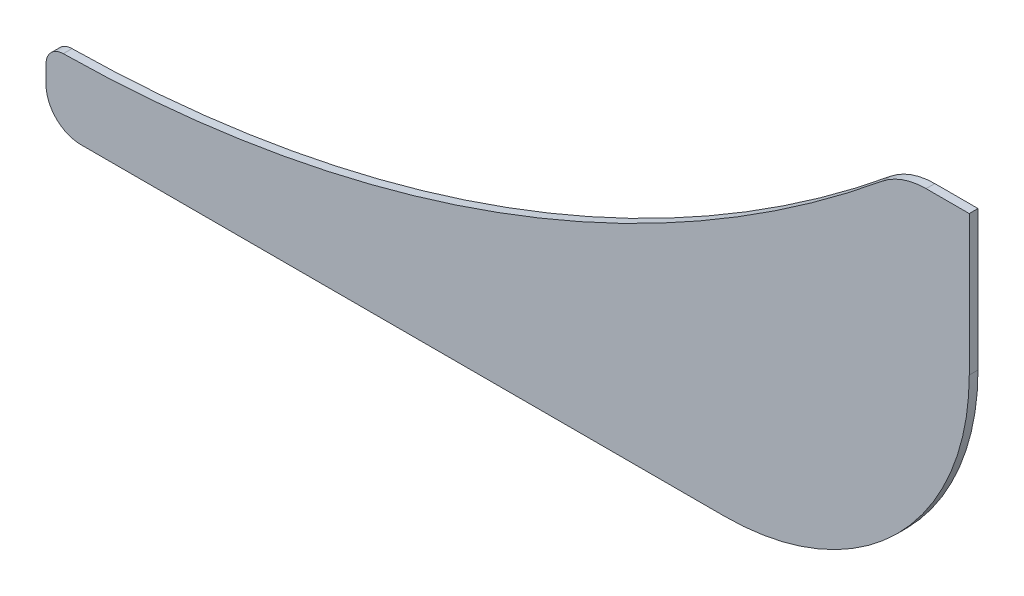
ISO-10303-21;
HEADER;
FILE_DESCRIPTION(('STEP AP214'),'2;1');
FILE_NAME('part.step','',(''),(''),'','','');
FILE_SCHEMA(('AUTOMOTIVE_DESIGN { 1 0 10303 214 1 1 1 1 }'));
ENDSEC;
DATA;
#1=APPLICATION_CONTEXT('core data for automotive mechanical design processes');
#2=APPLICATION_PROTOCOL_DEFINITION('international standard','automotive_design',2000,#1);
#3=PRODUCT_CONTEXT('',#1,'mechanical');
#4=PRODUCT('Part','Part','',(#3));
#5=PRODUCT_RELATED_PRODUCT_CATEGORY('part','',(#4));
#6=PRODUCT_DEFINITION_FORMATION('','',#4);
#7=PRODUCT_DEFINITION_CONTEXT('part definition',#1,'design');
#8=PRODUCT_DEFINITION('design','',#6,#7);
#9=PRODUCT_DEFINITION_SHAPE('','',#8);
#10=(LENGTH_UNIT() NAMED_UNIT(*) SI_UNIT(.MILLI.,.METRE.));
#11=(NAMED_UNIT(*) PLANE_ANGLE_UNIT() SI_UNIT($,.RADIAN.));
#12=(NAMED_UNIT(*) SI_UNIT($,.STERADIAN.) SOLID_ANGLE_UNIT());
#13=UNCERTAINTY_MEASURE_WITH_UNIT(LENGTH_MEASURE(1.E-05),#10,'distance_accuracy_value','');
#14=(GEOMETRIC_REPRESENTATION_CONTEXT(3) GLOBAL_UNCERTAINTY_ASSIGNED_CONTEXT((#13)) GLOBAL_UNIT_ASSIGNED_CONTEXT((#10,
#11,#12)) REPRESENTATION_CONTEXT('',''));
#15=CARTESIAN_POINT('',(0.,0.,0.));
#16=DIRECTION('',(0.,0.,1.));
#17=DIRECTION('',(1.,0.,0.));
#18=AXIS2_PLACEMENT_3D('',#15,#16,#17);
#19=CARTESIAN_POINT('',(0.,-7.62000000000009,6.35));
#20=DIRECTION('',(0.,-1.,0.));
#21=DIRECTION('',(1.,0.,0.));
#22=AXIS2_PLACEMENT_3D('',#19,#20,#21);
#23=PLANE('',#22);
#24=DIRECTION('',(-1.,0.,0.));
#25=VECTOR('',#24,1.);
#26=CARTESIAN_POINT('',(0.,-7.62000000000009,0.));
#27=LINE('',#26,#25);
#28=CARTESIAN_POINT('',(562.84881144586,-7.61999999999996,0.));
#29=VERTEX_POINT('',#28);
#30=CARTESIAN_POINT('',(531.483489064689,-7.61999999999997,0.));
#31=VERTEX_POINT('',#30);
#32=EDGE_CURVE('E128',#29,#31,#27,.T.);
#33=ORIENTED_EDGE('',*,*,#32,.T.);
#34=DIRECTION('',(0.,0.,-1.));
#35=VECTOR('',#34,1.);
#36=CARTESIAN_POINT('',(531.483489064689,-7.61999999999997,6.35));
#37=LINE('',#36,#35);
#38=CARTESIAN_POINT('',(531.483489064689,-7.61999999999997,6.35));
#39=VERTEX_POINT('',#38);
#40=EDGE_CURVE('E109',#39,#31,#37,.T.);
#41=ORIENTED_EDGE('',*,*,#40,.F.);
#42=DIRECTION('',(-1.,0.,0.));
#43=VECTOR('',#42,1.);
#44=CARTESIAN_POINT('',(0.,-7.62000000000009,6.35));
#45=LINE('',#44,#43);
#46=CARTESIAN_POINT('',(562.84881144586,-7.61999999999996,6.35));
#47=VERTEX_POINT('',#46);
#48=EDGE_CURVE('E115',#47,#39,#45,.T.);
#49=ORIENTED_EDGE('',*,*,#48,.F.);
#50=DIRECTION('',(0.,0.,-1.));
#51=VECTOR('',#50,1.);
#52=CARTESIAN_POINT('',(562.84881144586,-7.61999999999996,6.35));
#53=LINE('',#52,#51);
#54=EDGE_CURVE('E146',#47,#29,#53,.T.);
#55=ORIENTED_EDGE('',*,*,#54,.T.);
#56=EDGE_LOOP('',(#33,#41,#49,#55));
#57=FACE_BOUND('',#56,.T.);
#58=ADVANCED_FACE('F34',(#57),#23,.F.);
#59=CARTESIAN_POINT('',(531.483489064689,-58.4199999999999,6.35));
#60=DIRECTION('',(0.,0.,-1.));
#61=DIRECTION('',(-1.,0.,0.));
#62=AXIS2_PLACEMENT_3D('',#59,#60,#61);
#63=CYLINDRICAL_SURFACE('',#62,50.7999999999999);
#64=CARTESIAN_POINT('',(531.483489064689,-58.4199999999999,0.));
#65=DIRECTION('',(0.,0.,1.));
#66=DIRECTION('',(1.,0.,0.));
#67=AXIS2_PLACEMENT_3D('',#64,#65,#66);
#68=CIRCLE('',#67,50.7999999999999);
#69=CARTESIAN_POINT('',(499.277327240036,-19.133830162203,0.));
#70=VERTEX_POINT('',#69);
#71=EDGE_CURVE('E161',#31,#70,#68,.T.);
#72=ORIENTED_EDGE('',*,*,#71,.T.);
#73=DIRECTION('',(0.,0.,-1.));
#74=VECTOR('',#73,1.);
#75=CARTESIAN_POINT('',(499.277327240036,-19.133830162203,6.35));
#76=LINE('',#75,#74);
#77=CARTESIAN_POINT('',(499.277327240036,-19.133830162203,6.35));
#78=VERTEX_POINT('',#77);
#79=EDGE_CURVE('E112',#78,#70,#76,.T.);
#80=ORIENTED_EDGE('',*,*,#79,.F.);
#81=CARTESIAN_POINT('',(531.483489064689,-58.4199999999999,6.35));
#82=DIRECTION('',(0.,0.,1.));
#83=DIRECTION('',(1.,0.,0.));
#84=AXIS2_PLACEMENT_3D('',#81,#82,#83);
#85=CIRCLE('',#84,50.7999999999999);
#86=EDGE_CURVE('E104',#39,#78,#85,.T.);
#87=ORIENTED_EDGE('',*,*,#86,.F.);
#88=ORIENTED_EDGE('',*,*,#40,.T.);
#89=EDGE_LOOP('',(#72,#80,#87,#88));
#90=FACE_BOUND('',#89,.T.);
#91=ADVANCED_FACE('F107',(#90),#63,.T.);
#92=CARTESIAN_POINT('',(-107.95,721.582683590206,6.35));
#93=DIRECTION('',(0.,0.,-1.));
#94=DIRECTION('',(-1.,0.,0.));
#95=AXIS2_PLACEMENT_3D('',#92,#93,#94);
#96=CYLINDRICAL_SURFACE('',#95,957.802683590206);
#97=CARTESIAN_POINT('',(-107.95,721.582683590206,0.));
#98=DIRECTION('',(0.,0.,1.));
#99=DIRECTION('',(1.,0.,0.));
#100=AXIS2_PLACEMENT_3D('',#97,#98,#99);
#101=CIRCLE('',#100,957.802683590206);
#102=CARTESIAN_POINT('',(-95.4161922246349,-236.137987772405,0.));
#103=VERTEX_POINT('',#102);
#104=EDGE_CURVE('E159',#103,#70,#101,.T.);
#105=ORIENTED_EDGE('',*,*,#104,.F.);
#106=DIRECTION('',(0.,0.,-1.));
#107=VECTOR('',#106,1.);
#108=CARTESIAN_POINT('',(-95.4161922246349,-236.137987772405,6.35));
#109=LINE('',#108,#107);
#110=CARTESIAN_POINT('',(-95.4161922246349,-236.137987772405,6.35));
#111=VERTEX_POINT('',#110);
#112=EDGE_CURVE('E42',#103,#111,#109,.F.);
#113=ORIENTED_EDGE('',*,*,#112,.T.);
#114=CARTESIAN_POINT('',(-107.95,721.582683590206,6.35));
#115=DIRECTION('',(0.,0.,1.));
#116=DIRECTION('',(1.,0.,0.));
#117=AXIS2_PLACEMENT_3D('',#114,#115,#116);
#118=CIRCLE('',#117,957.802683590206);
#119=EDGE_CURVE('E114',#111,#78,#118,.T.);
#120=ORIENTED_EDGE('',*,*,#119,.T.);
#121=ORIENTED_EDGE('',*,*,#79,.T.);
#122=EDGE_LOOP('',(#105,#113,#120,#121));
#123=FACE_BOUND('',#122,.T.);
#124=ADVANCED_FACE('F174',(#123),#96,.F.);
#125=CARTESIAN_POINT('',(-107.950000000001,-5.89805981832122E-13,6.35));
#126=DIRECTION('',(1.,0.,0.));
#127=DIRECTION('',(0.,1.,0.));
#128=AXIS2_PLACEMENT_3D('',#125,#126,#127);
#129=PLANE('',#128);
#130=DIRECTION('',(0.,-1.,0.));
#131=VECTOR('',#130,1.);
#132=CARTESIAN_POINT('',(-107.950000000001,-5.89805981832122E-13,6.35));
#133=LINE('',#132,#131);
#134=CARTESIAN_POINT('',(-107.95,-248.836900329962,6.35));
#135=VERTEX_POINT('',#134);
#136=CARTESIAN_POINT('',(-107.95,-261.62,6.35));
#137=VERTEX_POINT('',#136);
#138=EDGE_CURVE('E172',#135,#137,#133,.T.);
#139=ORIENTED_EDGE('',*,*,#138,.F.);
#140=DIRECTION('',(0.,0.,1.));
#141=VECTOR('',#140,1.);
#142=CARTESIAN_POINT('',(-107.95,-248.836900329962,0.));
#143=LINE('',#142,#141);
#144=CARTESIAN_POINT('',(-107.95,-248.836900329962,0.));
#145=VERTEX_POINT('',#144);
#146=EDGE_CURVE('E129',#135,#145,#143,.F.);
#147=ORIENTED_EDGE('',*,*,#146,.T.);
#148=DIRECTION('',(0.,-1.,0.));
#149=VECTOR('',#148,1.);
#150=CARTESIAN_POINT('',(-107.950000000001,-5.89805981832122E-13,0.));
#151=LINE('',#150,#149);
#152=CARTESIAN_POINT('',(-107.95,-261.62,0.));
#153=VERTEX_POINT('',#152);
#154=EDGE_CURVE('E157',#145,#153,#151,.T.);
#155=ORIENTED_EDGE('',*,*,#154,.T.);
#156=DIRECTION('',(0.,0.,-1.));
#157=VECTOR('',#156,1.);
#158=CARTESIAN_POINT('',(-107.95,-261.62,6.35));
#159=LINE('',#158,#157);
#160=EDGE_CURVE('E133',#137,#153,#159,.T.);
#161=ORIENTED_EDGE('',*,*,#160,.F.);
#162=EDGE_LOOP('',(#139,#147,#155,#161));
#163=FACE_BOUND('',#162,.T.);
#164=ADVANCED_FACE('F180',(#163),#129,.F.);
#165=CARTESIAN_POINT('',(-82.55,-261.62,6.35));
#166=DIRECTION('',(0.,0.,-1.));
#167=DIRECTION('',(-1.,0.,0.));
#168=AXIS2_PLACEMENT_3D('',#165,#166,#167);
#169=CYLINDRICAL_SURFACE('',#168,25.4);
#170=CARTESIAN_POINT('',(-82.55,-261.62,0.));
#171=DIRECTION('',(0.,0.,1.));
#172=DIRECTION('',(1.,0.,0.));
#173=AXIS2_PLACEMENT_3D('',#170,#171,#172);
#174=CIRCLE('',#173,25.4);
#175=CARTESIAN_POINT('',(-82.55,-287.02,0.));
#176=VERTEX_POINT('',#175);
#177=EDGE_CURVE('E155',#153,#176,#174,.T.);
#178=ORIENTED_EDGE('',*,*,#177,.T.);
#179=DIRECTION('',(0.,0.,-1.));
#180=VECTOR('',#179,1.);
#181=CARTESIAN_POINT('',(-82.55,-287.02,6.35));
#182=LINE('',#181,#180);
#183=CARTESIAN_POINT('',(-82.55,-287.02,6.35));
#184=VERTEX_POINT('',#183);
#185=EDGE_CURVE('E139',#184,#176,#182,.T.);
#186=ORIENTED_EDGE('',*,*,#185,.F.);
#187=CARTESIAN_POINT('',(-82.55,-261.62,6.35));
#188=DIRECTION('',(0.,0.,1.));
#189=DIRECTION('',(1.,0.,0.));
#190=AXIS2_PLACEMENT_3D('',#187,#188,#189);
#191=CIRCLE('',#190,25.4);
#192=EDGE_CURVE('E170',#137,#184,#191,.T.);
#193=ORIENTED_EDGE('',*,*,#192,.F.);
#194=ORIENTED_EDGE('',*,*,#160,.T.);
#195=EDGE_LOOP('',(#178,#186,#193,#194));
#196=FACE_BOUND('',#195,.T.);
#197=ADVANCED_FACE('F187',(#196),#169,.T.);
#198=CARTESIAN_POINT('',(0.,-287.02,6.35));
#199=DIRECTION('',(0.,1.,0.));
#200=DIRECTION('',(-1.,0.,0.));
#201=AXIS2_PLACEMENT_3D('',#198,#199,#200);
#202=PLANE('',#201);
#203=DIRECTION('',(1.,0.,0.));
#204=VECTOR('',#203,1.);
#205=CARTESIAN_POINT('',(0.,-287.02,0.));
#206=LINE('',#205,#204);
#207=CARTESIAN_POINT('',(385.04881144586,-287.02,0.));
#208=VERTEX_POINT('',#207);
#209=EDGE_CURVE('E152',#176,#208,#206,.T.);
#210=ORIENTED_EDGE('',*,*,#209,.T.);
#211=DIRECTION('',(0.,0.,-1.));
#212=VECTOR('',#211,1.);
#213=CARTESIAN_POINT('',(385.04881144586,-287.02,6.35));
#214=LINE('',#213,#212);
#215=CARTESIAN_POINT('',(385.04881144586,-287.02,6.35));
#216=VERTEX_POINT('',#215);
#217=EDGE_CURVE('E142',#216,#208,#214,.T.);
#218=ORIENTED_EDGE('',*,*,#217,.F.);
#219=DIRECTION('',(1.,0.,0.));
#220=VECTOR('',#219,1.);
#221=CARTESIAN_POINT('',(0.,-287.02,6.35));
#222=LINE('',#221,#220);
#223=EDGE_CURVE('E168',#184,#216,#222,.T.);
#224=ORIENTED_EDGE('',*,*,#223,.F.);
#225=ORIENTED_EDGE('',*,*,#185,.T.);
#226=EDGE_LOOP('',(#210,#218,#224,#225));
#227=FACE_BOUND('',#226,.T.);
#228=ADVANCED_FACE('F191',(#227),#202,.F.);
#229=CARTESIAN_POINT('',(385.04881144586,-109.22,6.35));
#230=DIRECTION('',(0.,0.,-1.));
#231=DIRECTION('',(-1.,0.,0.));
#232=AXIS2_PLACEMENT_3D('',#229,#230,#231);
#233=CYLINDRICAL_SURFACE('',#232,177.8);
#234=CARTESIAN_POINT('',(385.04881144586,-109.22,0.));
#235=DIRECTION('',(0.,0.,1.));
#236=DIRECTION('',(1.,0.,0.));
#237=AXIS2_PLACEMENT_3D('',#234,#235,#236);
#238=CIRCLE('',#237,177.8);
#239=CARTESIAN_POINT('',(562.84881144586,-109.22,0.));
#240=VERTEX_POINT('',#239);
#241=EDGE_CURVE('E149',#240,#208,#238,.F.);
#242=ORIENTED_EDGE('',*,*,#241,.F.);
#243=DIRECTION('',(0.,0.,-1.));
#244=VECTOR('',#243,1.);
#245=CARTESIAN_POINT('',(562.84881144586,-109.22,6.35));
#246=LINE('',#245,#244);
#247=CARTESIAN_POINT('',(562.84881144586,-109.22,6.35));
#248=VERTEX_POINT('',#247);
#249=EDGE_CURVE('E144',#248,#240,#246,.T.);
#250=ORIENTED_EDGE('',*,*,#249,.F.);
#251=CARTESIAN_POINT('',(385.04881144586,-109.22,6.35));
#252=DIRECTION('',(0.,0.,1.));
#253=DIRECTION('',(1.,0.,0.));
#254=AXIS2_PLACEMENT_3D('',#251,#252,#253);
#255=CIRCLE('',#254,177.8);
#256=EDGE_CURVE('E165',#248,#216,#255,.F.);
#257=ORIENTED_EDGE('',*,*,#256,.T.);
#258=ORIENTED_EDGE('',*,*,#217,.T.);
#259=EDGE_LOOP('',(#242,#250,#257,#258));
#260=FACE_BOUND('',#259,.T.);
#261=ADVANCED_FACE('F195',(#260),#233,.T.);
#262=CARTESIAN_POINT('',(562.84881144586,-6.15046958513875E-13,6.35));
#263=DIRECTION('',(-1.,0.,0.));
#264=DIRECTION('',(0.,-1.,0.));
#265=AXIS2_PLACEMENT_3D('',#262,#263,#264);
#266=PLANE('',#265);
#267=DIRECTION('',(0.,1.,0.));
#268=VECTOR('',#267,1.);
#269=CARTESIAN_POINT('',(562.84881144586,-6.15046958513875E-13,0.));
#270=LINE('',#269,#268);
#271=EDGE_CURVE('E125',#240,#29,#270,.T.);
#272=ORIENTED_EDGE('',*,*,#271,.T.);
#273=ORIENTED_EDGE('',*,*,#54,.F.);
#274=DIRECTION('',(0.,1.,0.));
#275=VECTOR('',#274,1.);
#276=CARTESIAN_POINT('',(562.84881144586,-6.15046958513875E-13,6.35));
#277=LINE('',#276,#275);
#278=EDGE_CURVE('E121',#248,#47,#277,.T.);
#279=ORIENTED_EDGE('',*,*,#278,.F.);
#280=ORIENTED_EDGE('',*,*,#249,.T.);
#281=EDGE_LOOP('',(#272,#273,#279,#280));
#282=FACE_BOUND('',#281,.T.);
#283=ADVANCED_FACE('F198',(#282),#266,.F.);
#284=CARTESIAN_POINT('',(0.,0.,6.35));
#285=DIRECTION('',(0.,0.,1.));
#286=DIRECTION('',(1.,0.,0.));
#287=AXIS2_PLACEMENT_3D('',#284,#285,#286);
#288=PLANE('',#287);
#289=ORIENTED_EDGE('',*,*,#119,.F.);
#290=CARTESIAN_POINT('',(-95.25,-248.836900329962,6.35));
#291=DIRECTION('',(0.,0.,1.));
#292=DIRECTION('',(1.,0.,0.));
#293=AXIS2_PLACEMENT_3D('',#290,#291,#292);
#294=CIRCLE('',#293,12.7);
#295=EDGE_CURVE('E11',#111,#135,#294,.T.);
#296=ORIENTED_EDGE('',*,*,#295,.T.);
#297=ORIENTED_EDGE('',*,*,#138,.T.);
#298=ORIENTED_EDGE('',*,*,#192,.T.);
#299=ORIENTED_EDGE('',*,*,#223,.T.);
#300=ORIENTED_EDGE('',*,*,#256,.F.);
#301=ORIENTED_EDGE('',*,*,#278,.T.);
#302=ORIENTED_EDGE('',*,*,#48,.T.);
#303=ORIENTED_EDGE('',*,*,#86,.T.);
#304=EDGE_LOOP('',(#289,#296,#297,#298,#299,#300,#301,#302,#303));
#305=FACE_BOUND('',#304,.T.);
#306=ADVANCED_FACE('F118',(#305),#288,.T.);
#307=CARTESIAN_POINT('',(0.,0.,0.));
#308=DIRECTION('',(0.,0.,1.));
#309=DIRECTION('',(1.,0.,0.));
#310=AXIS2_PLACEMENT_3D('',#307,#308,#309);
#311=PLANE('',#310);
#312=ORIENTED_EDGE('',*,*,#154,.F.);
#313=CARTESIAN_POINT('',(-95.25,-248.836900329962,0.));
#314=DIRECTION('',(0.,0.,1.));
#315=DIRECTION('',(1.,0.,0.));
#316=AXIS2_PLACEMENT_3D('',#313,#314,#315);
#317=CIRCLE('',#316,12.7);
#318=EDGE_CURVE('E56',#145,#103,#317,.F.);
#319=ORIENTED_EDGE('',*,*,#318,.T.);
#320=ORIENTED_EDGE('',*,*,#104,.T.);
#321=ORIENTED_EDGE('',*,*,#71,.F.);
#322=ORIENTED_EDGE('',*,*,#32,.F.);
#323=ORIENTED_EDGE('',*,*,#271,.F.);
#324=ORIENTED_EDGE('',*,*,#241,.T.);
#325=ORIENTED_EDGE('',*,*,#209,.F.);
#326=ORIENTED_EDGE('',*,*,#177,.F.);
#327=EDGE_LOOP('',(#312,#319,#320,#321,#322,#323,#324,#325,#326));
#328=FACE_BOUND('',#327,.T.);
#329=ADVANCED_FACE('F183',(#328),#311,.F.);
#330=CARTESIAN_POINT('',(-95.25,-248.836900329962,6.35));
#331=DIRECTION('',(0.,0.,-1.));
#332=DIRECTION('',(-1.,0.,0.));
#333=AXIS2_PLACEMENT_3D('',#330,#331,#332);
#334=CYLINDRICAL_SURFACE('',#333,12.7);
#335=ORIENTED_EDGE('',*,*,#295,.F.);
#336=ORIENTED_EDGE('',*,*,#112,.F.);
#337=ORIENTED_EDGE('',*,*,#318,.F.);
#338=ORIENTED_EDGE('',*,*,#146,.F.);
#339=EDGE_LOOP('',(#335,#336,#337,#338));
#340=FACE_BOUND('',#339,.T.);
#341=ADVANCED_FACE('F36',(#340),#334,.T.);
#342=CLOSED_SHELL('',(#58,#91,#124,#164,#197,#228,#261,#283,#306,#329,#341));
#343=MANIFOLD_SOLID_BREP('B2',#342);
#344=ADVANCED_BREP_SHAPE_REPRESENTATION('',(#18,#343),#14);
#345=SHAPE_DEFINITION_REPRESENTATION(#9,#344);
ENDSEC;
END-ISO-10303-21;
